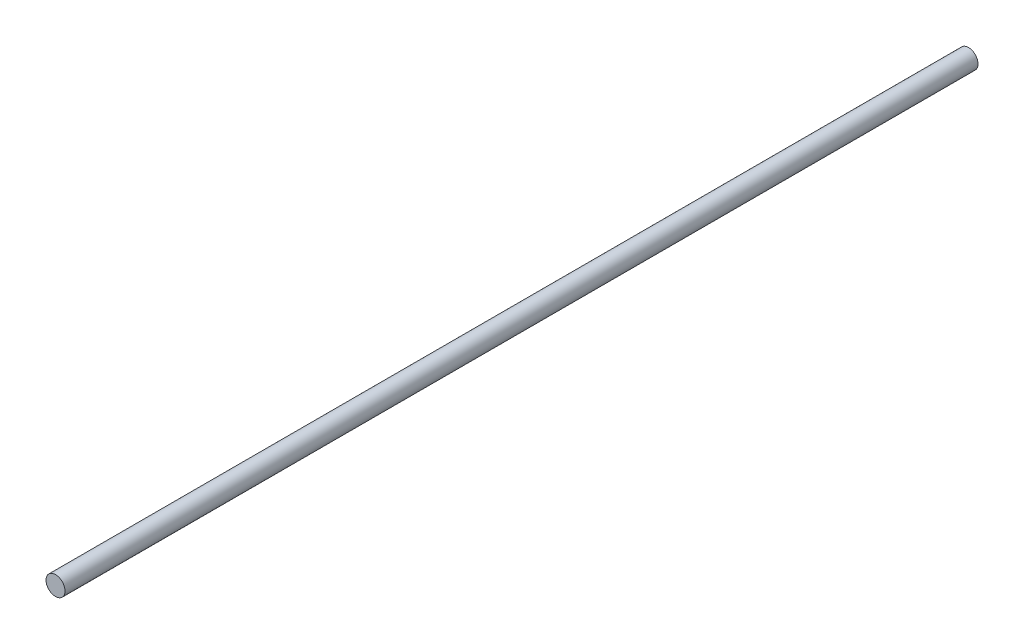
ISO-10303-21;
HEADER;
FILE_DESCRIPTION(('STEP AP214'),'2;1');
FILE_NAME('part.step','',(''),(''),'','','');
FILE_SCHEMA(('AUTOMOTIVE_DESIGN { 1 0 10303 214 1 1 1 1 }'));
ENDSEC;
DATA;
#1=APPLICATION_CONTEXT('core data for automotive mechanical design processes');
#2=APPLICATION_PROTOCOL_DEFINITION('international standard','automotive_design',2000,#1);
#3=PRODUCT_CONTEXT('',#1,'mechanical');
#4=PRODUCT('Part','Part','',(#3));
#5=PRODUCT_RELATED_PRODUCT_CATEGORY('part','',(#4));
#6=PRODUCT_DEFINITION_FORMATION('','',#4);
#7=PRODUCT_DEFINITION_CONTEXT('part definition',#1,'design');
#8=PRODUCT_DEFINITION('design','',#6,#7);
#9=PRODUCT_DEFINITION_SHAPE('','',#8);
#10=(LENGTH_UNIT() NAMED_UNIT(*) SI_UNIT(.MILLI.,.METRE.));
#11=(NAMED_UNIT(*) PLANE_ANGLE_UNIT() SI_UNIT($,.RADIAN.));
#12=(NAMED_UNIT(*) SI_UNIT($,.STERADIAN.) SOLID_ANGLE_UNIT());
#13=UNCERTAINTY_MEASURE_WITH_UNIT(LENGTH_MEASURE(1.E-05),#10,'distance_accuracy_value','');
#14=(GEOMETRIC_REPRESENTATION_CONTEXT(3) GLOBAL_UNCERTAINTY_ASSIGNED_CONTEXT((#13)) GLOBAL_UNIT_ASSIGNED_CONTEXT((#10,
#11,#12)) REPRESENTATION_CONTEXT('',''));
#15=CARTESIAN_POINT('',(0.,0.,0.));
#16=DIRECTION('',(0.,0.,1.));
#17=DIRECTION('',(1.,0.,0.));
#18=AXIS2_PLACEMENT_3D('',#15,#16,#17);
#19=CARTESIAN_POINT('',(0.,0.,152.4));
#20=DIRECTION('',(0.,0.,-1.));
#21=DIRECTION('',(-1.,0.,0.));
#22=AXIS2_PLACEMENT_3D('',#19,#20,#21);
#23=CYLINDRICAL_SURFACE('',#22,3.175);
#24=CARTESIAN_POINT('',(0.,0.,152.4));
#25=DIRECTION('',(0.,0.,1.));
#26=DIRECTION('',(1.,0.,0.));
#27=AXIS2_PLACEMENT_3D('',#24,#25,#26);
#28=CIRCLE('',#27,3.175);
#29=CARTESIAN_POINT('',(-3.175,0.,152.4));
#30=VERTEX_POINT('',#29);
#31=EDGE_CURVE('E10',#30,#30,#28,.T.);
#32=CARTESIAN_POINT('',(0.,0.,-152.4));
#33=DIRECTION('',(0.,0.,1.));
#34=DIRECTION('',(1.,0.,0.));
#35=AXIS2_PLACEMENT_3D('',#32,#33,#34);
#36=CIRCLE('',#35,3.175);
#37=CARTESIAN_POINT('',(-3.175,0.,-152.4));
#38=VERTEX_POINT('',#37);
#39=EDGE_CURVE('E36',#38,#38,#36,.T.);
#40=CARTESIAN_POINT('',(-3.175,0.,152.4));
#41=CARTESIAN_POINT('',(-3.175,0.,149.225));
#42=CARTESIAN_POINT('',(-3.175,0.,146.05));
#43=CARTESIAN_POINT('',(-3.175,0.,139.7));
#44=CARTESIAN_POINT('',(-3.175,0.,136.525));
#45=CARTESIAN_POINT('',(-3.175,0.,130.175));
#46=CARTESIAN_POINT('',(-3.175,0.,127.));
#47=CARTESIAN_POINT('',(-3.175,0.,120.65));
#48=CARTESIAN_POINT('',(-3.175,0.,117.475));
#49=CARTESIAN_POINT('',(-3.175,0.,111.125));
#50=CARTESIAN_POINT('',(-3.175,0.,107.95));
#51=CARTESIAN_POINT('',(-3.175,0.,101.6));
#52=CARTESIAN_POINT('',(-3.175,0.,98.425));
#53=CARTESIAN_POINT('',(-3.175,0.,92.075));
#54=CARTESIAN_POINT('',(-3.175,0.,88.9));
#55=CARTESIAN_POINT('',(-3.175,0.,82.55));
#56=CARTESIAN_POINT('',(-3.175,0.,79.375));
#57=CARTESIAN_POINT('',(-3.175,0.,73.025));
#58=CARTESIAN_POINT('',(-3.175,0.,69.85));
#59=CARTESIAN_POINT('',(-3.175,0.,63.5));
#60=CARTESIAN_POINT('',(-3.175,0.,60.325));
#61=CARTESIAN_POINT('',(-3.175,0.,53.975));
#62=CARTESIAN_POINT('',(-3.175,0.,50.8));
#63=CARTESIAN_POINT('',(-3.175,0.,44.45));
#64=CARTESIAN_POINT('',(-3.175,0.,41.275));
#65=CARTESIAN_POINT('',(-3.175,0.,34.925));
#66=CARTESIAN_POINT('',(-3.175,0.,31.75));
#67=CARTESIAN_POINT('',(-3.175,0.,25.4));
#68=CARTESIAN_POINT('',(-3.175,0.,22.225));
#69=CARTESIAN_POINT('',(-3.175,0.,15.875));
#70=CARTESIAN_POINT('',(-3.175,0.,12.7));
#71=CARTESIAN_POINT('',(-3.175,0.,6.34999999999998));
#72=CARTESIAN_POINT('',(-3.175,0.,3.17499999999997));
#73=CARTESIAN_POINT('',(-3.175,0.,-3.17500000000003));
#74=CARTESIAN_POINT('',(-3.175,0.,-6.35000000000003));
#75=CARTESIAN_POINT('',(-3.175,0.,-12.7));
#76=CARTESIAN_POINT('',(-3.175,0.,-15.875));
#77=CARTESIAN_POINT('',(-3.175,0.,-22.225));
#78=CARTESIAN_POINT('',(-3.175,0.,-25.4));
#79=CARTESIAN_POINT('',(-3.175,0.,-31.75));
#80=CARTESIAN_POINT('',(-3.175,0.,-34.925));
#81=CARTESIAN_POINT('',(-3.175,0.,-41.275));
#82=CARTESIAN_POINT('',(-3.175,0.,-44.45));
#83=CARTESIAN_POINT('',(-3.175,0.,-50.8));
#84=CARTESIAN_POINT('',(-3.175,0.,-53.975));
#85=CARTESIAN_POINT('',(-3.175,0.,-60.325));
#86=CARTESIAN_POINT('',(-3.175,0.,-63.5));
#87=CARTESIAN_POINT('',(-3.175,0.,-69.85));
#88=CARTESIAN_POINT('',(-3.175,0.,-73.025));
#89=CARTESIAN_POINT('',(-3.175,0.,-79.375));
#90=CARTESIAN_POINT('',(-3.175,0.,-82.5500000000001));
#91=CARTESIAN_POINT('',(-3.175,0.,-88.9));
#92=CARTESIAN_POINT('',(-3.175,0.,-92.0750000000001));
#93=CARTESIAN_POINT('',(-3.175,0.,-98.425));
#94=CARTESIAN_POINT('',(-3.175,0.,-101.6));
#95=CARTESIAN_POINT('',(-3.175,0.,-107.95));
#96=CARTESIAN_POINT('',(-3.175,0.,-111.125));
#97=CARTESIAN_POINT('',(-3.175,0.,-117.475));
#98=CARTESIAN_POINT('',(-3.175,0.,-120.65));
#99=CARTESIAN_POINT('',(-3.175,0.,-127.));
#100=CARTESIAN_POINT('',(-3.175,0.,-130.175));
#101=CARTESIAN_POINT('',(-3.175,0.,-136.525));
#102=CARTESIAN_POINT('',(-3.175,0.,-139.7));
#103=CARTESIAN_POINT('',(-3.175,0.,-146.05));
#104=CARTESIAN_POINT('',(-3.175,0.,-149.225));
#105=CARTESIAN_POINT('',(-3.175,0.,-152.4));
#106=B_SPLINE_CURVE_WITH_KNOTS('',3,(#40,#41,#42,#43,#44,#45,#46,#47,#48,#49,#50,#51,#52,#53,
#54,#55,#56,#57,#58,#59,#60,#61,#62,#63,#64,#65,#66,#67,#68,#69,#70,#71,#72,#73,#74,#75,#76,#77,
#78,#79,#80,#81,#82,#83,#84,#85,#86,#87,#88,#89,#90,#91,#92,#93,#94,#95,#96,#97,#98,#99,#100,
#101,#102,#103,#104,#105),.UNSPECIFIED.,.F.,.F.,(4,2,2,2,2,2,2,2,2,2,2,2,2,2,2,2,2,2,2,2,2,2,2,
2,2,2,2,2,2,2,2,2,4),(0.,9.52499999999998,19.05,28.575,38.1,47.625,57.15,66.675,76.2,85.725,
95.25,104.775,114.3,123.825,133.35,142.875,152.4,161.925,171.45,180.975,190.5,200.025,209.55,
219.075,228.6,238.125,247.65,257.175,266.7,276.225,285.75,295.275,304.8),.UNSPECIFIED.);
#107=EDGE_CURVE('BSEAM33',#30,#38,#106,.T.);
#108=ORIENTED_EDGE('',*,*,#31,.F.);
#109=ORIENTED_EDGE('',*,*,#39,.T.);
#110=ORIENTED_EDGE('',*,*,#107,.T.);
#111=ORIENTED_EDGE('',*,*,#107,.F.);
#112=EDGE_LOOP('',(#108,#110,#109,#111));
#113=FACE_BOUND('',#112,.T.);
#114=ADVANCED_FACE('F33',(#113),#23,.T.);
#115=CARTESIAN_POINT('',(0.,0.,152.4));
#116=DIRECTION('',(0.,0.,1.));
#117=DIRECTION('',(1.,0.,0.));
#118=AXIS2_PLACEMENT_3D('',#115,#116,#117);
#119=PLANE('',#118);
#120=ORIENTED_EDGE('',*,*,#31,.T.);
#121=EDGE_LOOP('',(#120));
#122=FACE_BOUND('',#121,.T.);
#123=ADVANCED_FACE('F48',(#122),#119,.T.);
#124=CARTESIAN_POINT('',(0.,0.,-152.4));
#125=DIRECTION('',(0.,0.,1.));
#126=DIRECTION('',(1.,0.,0.));
#127=AXIS2_PLACEMENT_3D('',#124,#125,#126);
#128=PLANE('',#127);
#129=ORIENTED_EDGE('',*,*,#39,.F.);
#130=EDGE_LOOP('',(#129));
#131=FACE_BOUND('',#130,.T.);
#132=ADVANCED_FACE('F46',(#131),#128,.F.);
#133=CLOSED_SHELL('',(#114,#123,#132));
#134=MANIFOLD_SOLID_BREP('B2',#133);
#135=ADVANCED_BREP_SHAPE_REPRESENTATION('',(#18,#134),#14);
#136=SHAPE_DEFINITION_REPRESENTATION(#9,#135);
ENDSEC;
END-ISO-10303-21;
